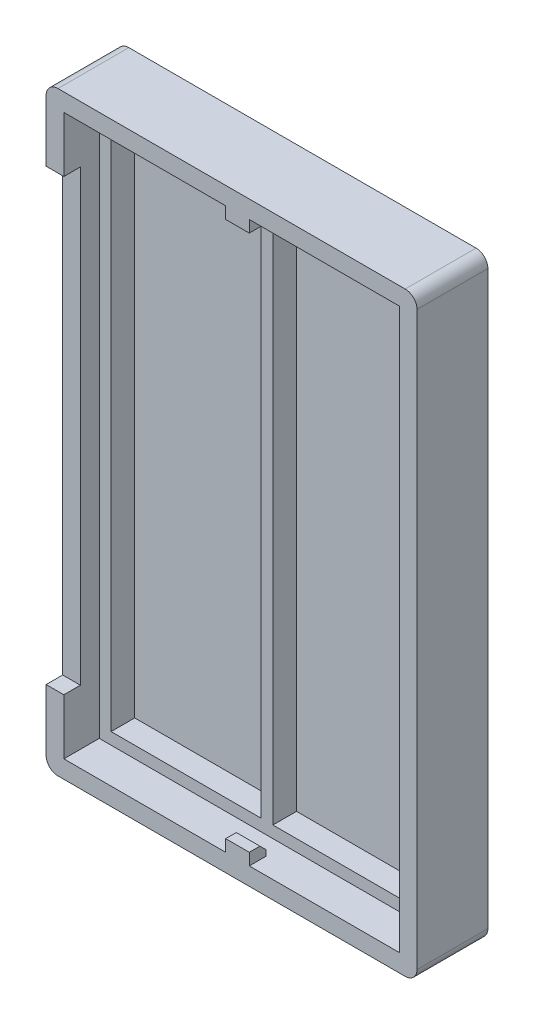
ISO-10303-21;
HEADER;
FILE_DESCRIPTION(('STEP AP214'),'2;1');
FILE_NAME('part.step','',(''),(''),'','','');
FILE_SCHEMA(('AUTOMOTIVE_DESIGN { 1 0 10303 214 1 1 1 1 }'));
ENDSEC;
DATA;
#1=APPLICATION_CONTEXT('core data for automotive mechanical design processes');
#2=APPLICATION_PROTOCOL_DEFINITION('international standard','automotive_design',2000,#1);
#3=PRODUCT_CONTEXT('',#1,'mechanical');
#4=PRODUCT('Part','Part','',(#3));
#5=PRODUCT_RELATED_PRODUCT_CATEGORY('part','',(#4));
#6=PRODUCT_DEFINITION_FORMATION('','',#4);
#7=PRODUCT_DEFINITION_CONTEXT('part definition',#1,'design');
#8=PRODUCT_DEFINITION('design','',#6,#7);
#9=PRODUCT_DEFINITION_SHAPE('','',#8);
#10=(LENGTH_UNIT() NAMED_UNIT(*) SI_UNIT(.MILLI.,.METRE.));
#11=(NAMED_UNIT(*) PLANE_ANGLE_UNIT() SI_UNIT($,.RADIAN.));
#12=(NAMED_UNIT(*) SI_UNIT($,.STERADIAN.) SOLID_ANGLE_UNIT());
#13=UNCERTAINTY_MEASURE_WITH_UNIT(LENGTH_MEASURE(1.E-05),#10,'distance_accuracy_value','');
#14=(GEOMETRIC_REPRESENTATION_CONTEXT(3) GLOBAL_UNCERTAINTY_ASSIGNED_CONTEXT((#13)) GLOBAL_UNIT_ASSIGNED_CONTEXT((#10,
#11,#12)) REPRESENTATION_CONTEXT('',''));
#15=CARTESIAN_POINT('',(0.,0.,0.));
#16=DIRECTION('',(0.,0.,1.));
#17=DIRECTION('',(1.,0.,0.));
#18=AXIS2_PLACEMENT_3D('',#15,#16,#17);
#19=CARTESIAN_POINT('',(-14.2,23.7,6.));
#20=DIRECTION('',(0.,1.,0.));
#21=DIRECTION('',(0.,0.,1.));
#22=AXIS2_PLACEMENT_3D('',#19,#20,#21);
#23=PLANE('',#22);
#24=DIRECTION('',(0.,0.,-1.));
#25=VECTOR('',#24,1.);
#26=CARTESIAN_POINT('',(1.5,23.7,8.23606797749979));
#27=LINE('',#26,#25);
#28=CARTESIAN_POINT('',(1.5,23.7,6.));
#29=VERTEX_POINT('',#28);
#30=CARTESIAN_POINT('',(1.5,23.7,4.6));
#31=VERTEX_POINT('',#30);
#32=EDGE_CURVE('E338',#29,#31,#27,.T.);
#33=ORIENTED_EDGE('',*,*,#32,.T.);
#34=DIRECTION('',(-1.,0.,0.));
#35=VECTOR('',#34,1.);
#36=CARTESIAN_POINT('',(-0.5,23.7,4.6));
#37=LINE('',#36,#35);
#38=CARTESIAN_POINT('',(-0.5,23.7,4.6));
#39=VERTEX_POINT('',#38);
#40=EDGE_CURVE('E331',#31,#39,#37,.T.);
#41=ORIENTED_EDGE('',*,*,#40,.T.);
#42=DIRECTION('',(0.,0.,-1.));
#43=VECTOR('',#42,1.);
#44=CARTESIAN_POINT('',(-0.5,23.7,8.23606797749979));
#45=LINE('',#44,#43);
#46=CARTESIAN_POINT('',(-0.5,23.7,6.));
#47=VERTEX_POINT('',#46);
#48=EDGE_CURVE('E335',#47,#39,#45,.T.);
#49=ORIENTED_EDGE('',*,*,#48,.F.);
#50=DIRECTION('',(1.,0.,0.));
#51=VECTOR('',#50,1.);
#52=CARTESIAN_POINT('',(-14.2,23.7,6.));
#53=LINE('',#52,#51);
#54=CARTESIAN_POINT('',(-14.2,23.7,6.));
#55=VERTEX_POINT('',#54);
#56=EDGE_CURVE('E384',#55,#47,#53,.T.);
#57=ORIENTED_EDGE('',*,*,#56,.F.);
#58=DIRECTION('',(0.,0.,-1.));
#59=VECTOR('',#58,1.);
#60=CARTESIAN_POINT('',(-14.2,23.7,6.));
#61=LINE('',#60,#59);
#62=CARTESIAN_POINT('',(-14.2,23.7,3.));
#63=VERTEX_POINT('',#62);
#64=EDGE_CURVE('E403',#55,#63,#61,.T.);
#65=ORIENTED_EDGE('',*,*,#64,.T.);
#66=DIRECTION('',(-1.,0.,0.));
#67=VECTOR('',#66,1.);
#68=CARTESIAN_POINT('',(14.2,23.7,3.));
#69=LINE('',#68,#67);
#70=CARTESIAN_POINT('',(14.2,23.7,3.));
#71=VERTEX_POINT('',#70);
#72=EDGE_CURVE('E538',#71,#63,#69,.T.);
#73=ORIENTED_EDGE('',*,*,#72,.F.);
#74=DIRECTION('',(0.,0.,-1.));
#75=VECTOR('',#74,1.);
#76=CARTESIAN_POINT('',(14.2,23.7,6.));
#77=LINE('',#76,#75);
#78=CARTESIAN_POINT('',(14.2,23.7,6.));
#79=VERTEX_POINT('',#78);
#80=EDGE_CURVE('E402',#79,#71,#77,.T.);
#81=ORIENTED_EDGE('',*,*,#80,.F.);
#82=EDGE_CURVE('E322',#29,#79,#53,.T.);
#83=ORIENTED_EDGE('',*,*,#82,.F.);
#84=EDGE_LOOP('',(#33,#41,#49,#57,#65,#73,#81,#83));
#85=FACE_BOUND('',#84,.T.);
#86=ADVANCED_FACE('F49',(#85),#23,.F.);
#87=CARTESIAN_POINT('',(14.2,-23.7,6.));
#88=DIRECTION('',(0.,-1.,0.));
#89=DIRECTION('',(0.,0.,-1.));
#90=AXIS2_PLACEMENT_3D('',#87,#88,#89);
#91=PLANE('',#90);
#92=DIRECTION('',(0.,0.,-1.));
#93=VECTOR('',#92,1.);
#94=CARTESIAN_POINT('',(1.5,-23.7,8.23606797749979));
#95=LINE('',#94,#93);
#96=CARTESIAN_POINT('',(1.5,-23.7,6.));
#97=VERTEX_POINT('',#96);
#98=CARTESIAN_POINT('',(1.5,-23.7,4.6));
#99=VERTEX_POINT('',#98);
#100=EDGE_CURVE('E361',#97,#99,#95,.T.);
#101=ORIENTED_EDGE('',*,*,#100,.F.);
#102=DIRECTION('',(-1.,0.,0.));
#103=VECTOR('',#102,1.);
#104=CARTESIAN_POINT('',(14.2,-23.7,6.));
#105=LINE('',#104,#103);
#106=CARTESIAN_POINT('',(14.2,-23.7,6.));
#107=VERTEX_POINT('',#106);
#108=EDGE_CURVE('E393',#107,#97,#105,.T.);
#109=ORIENTED_EDGE('',*,*,#108,.F.);
#110=DIRECTION('',(0.,0.,-1.));
#111=VECTOR('',#110,1.);
#112=CARTESIAN_POINT('',(14.2,-23.7,6.));
#113=LINE('',#112,#111);
#114=CARTESIAN_POINT('',(14.2,-23.7,3.));
#115=VERTEX_POINT('',#114);
#116=EDGE_CURVE('E412',#107,#115,#113,.T.);
#117=ORIENTED_EDGE('',*,*,#116,.T.);
#118=DIRECTION('',(1.,0.,0.));
#119=VECTOR('',#118,1.);
#120=CARTESIAN_POINT('',(-14.2,-23.7,3.));
#121=LINE('',#120,#119);
#122=CARTESIAN_POINT('',(-14.2,-23.7,3.));
#123=VERTEX_POINT('',#122);
#124=EDGE_CURVE('E530',#123,#115,#121,.T.);
#125=ORIENTED_EDGE('',*,*,#124,.F.);
#126=DIRECTION('',(0.,0.,-1.));
#127=VECTOR('',#126,1.);
#128=CARTESIAN_POINT('',(-14.2,-23.7,6.));
#129=LINE('',#128,#127);
#130=CARTESIAN_POINT('',(-14.2,-23.7,6.));
#131=VERTEX_POINT('',#130);
#132=EDGE_CURVE('E408',#131,#123,#129,.T.);
#133=ORIENTED_EDGE('',*,*,#132,.F.);
#134=CARTESIAN_POINT('',(-0.5,-23.7,6.));
#135=VERTEX_POINT('',#134);
#136=EDGE_CURVE('E392',#135,#131,#105,.T.);
#137=ORIENTED_EDGE('',*,*,#136,.F.);
#138=DIRECTION('',(0.,0.,-1.));
#139=VECTOR('',#138,1.);
#140=CARTESIAN_POINT('',(-0.5,-23.7,8.23606797749979));
#141=LINE('',#140,#139);
#142=CARTESIAN_POINT('',(-0.5,-23.7,4.6));
#143=VERTEX_POINT('',#142);
#144=EDGE_CURVE('E357',#135,#143,#141,.T.);
#145=ORIENTED_EDGE('',*,*,#144,.T.);
#146=DIRECTION('',(1.,0.,0.));
#147=VECTOR('',#146,1.);
#148=CARTESIAN_POINT('',(-0.5,-23.7,4.6));
#149=LINE('',#148,#147);
#150=EDGE_CURVE('E372',#143,#99,#149,.T.);
#151=ORIENTED_EDGE('',*,*,#150,.T.);
#152=EDGE_LOOP('',(#101,#109,#117,#125,#133,#137,#145,#151));
#153=FACE_BOUND('',#152,.T.);
#154=ADVANCED_FACE('F657',(#153),#91,.F.);
#155=CARTESIAN_POINT('',(0.,0.,3.));
#156=DIRECTION('',(0.,0.,1.));
#157=DIRECTION('',(1.,0.,0.));
#158=AXIS2_PLACEMENT_3D('',#155,#156,#157);
#159=PLANE('',#158);
#160=ORIENTED_EDGE('',*,*,#124,.T.);
#161=DIRECTION('',(0.,1.,0.));
#162=VECTOR('',#161,1.);
#163=CARTESIAN_POINT('',(14.2,-23.7,3.));
#164=LINE('',#163,#162);
#165=EDGE_CURVE('E534',#115,#71,#164,.T.);
#166=ORIENTED_EDGE('',*,*,#165,.T.);
#167=ORIENTED_EDGE('',*,*,#72,.T.);
#168=DIRECTION('',(0.,-1.,0.));
#169=VECTOR('',#168,1.);
#170=CARTESIAN_POINT('',(-14.2,23.7,3.));
#171=LINE('',#170,#169);
#172=EDGE_CURVE('E542',#63,#123,#171,.T.);
#173=ORIENTED_EDGE('',*,*,#172,.T.);
#174=EDGE_LOOP('',(#160,#166,#167,#173));
#175=FACE_BOUND('',#174,.T.);
#176=DIRECTION('',(0.,-1.,0.));
#177=VECTOR('',#176,1.);
#178=CARTESIAN_POINT('',(0.5,22.7,3.));
#179=LINE('',#178,#177);
#180=CARTESIAN_POINT('',(0.5,22.7,3.));
#181=VERTEX_POINT('',#180);
#182=CARTESIAN_POINT('',(0.500000000000006,-22.7,3.));
#183=VERTEX_POINT('',#182);
#184=EDGE_CURVE('E493',#181,#183,#179,.T.);
#185=ORIENTED_EDGE('',*,*,#184,.F.);
#186=DIRECTION('',(-1.,0.,0.));
#187=VECTOR('',#186,1.);
#188=CARTESIAN_POINT('',(13.2,22.7,3.));
#189=LINE('',#188,#187);
#190=CARTESIAN_POINT('',(13.2,22.7,3.));
#191=VERTEX_POINT('',#190);
#192=EDGE_CURVE('E490',#191,#181,#189,.T.);
#193=ORIENTED_EDGE('',*,*,#192,.F.);
#194=DIRECTION('',(0.,1.,0.));
#195=VECTOR('',#194,1.);
#196=CARTESIAN_POINT('',(13.2,-22.7,3.));
#197=LINE('',#196,#195);
#198=CARTESIAN_POINT('',(13.2,-22.7,3.));
#199=VERTEX_POINT('',#198);
#200=EDGE_CURVE('E501',#199,#191,#197,.T.);
#201=ORIENTED_EDGE('',*,*,#200,.F.);
#202=DIRECTION('',(1.,0.,0.));
#203=VECTOR('',#202,1.);
#204=CARTESIAN_POINT('',(0.500000000000006,-22.7,3.));
#205=LINE('',#204,#203);
#206=EDGE_CURVE('E497',#183,#199,#205,.T.);
#207=ORIENTED_EDGE('',*,*,#206,.F.);
#208=EDGE_LOOP('',(#185,#193,#201,#207));
#209=FACE_BOUND('',#208,.T.);
#210=DIRECTION('',(0.,-1.,0.));
#211=VECTOR('',#210,1.);
#212=CARTESIAN_POINT('',(-13.2,22.7,3.));
#213=LINE('',#212,#211);
#214=CARTESIAN_POINT('',(-13.2,22.7,3.));
#215=VERTEX_POINT('',#214);
#216=CARTESIAN_POINT('',(-13.2,-22.7,3.));
#217=VERTEX_POINT('',#216);
#218=EDGE_CURVE('E452',#215,#217,#213,.T.);
#219=ORIENTED_EDGE('',*,*,#218,.F.);
#220=DIRECTION('',(-1.,0.,0.));
#221=VECTOR('',#220,1.);
#222=CARTESIAN_POINT('',(-0.5,22.7,3.));
#223=LINE('',#222,#221);
#224=CARTESIAN_POINT('',(-0.5,22.7,3.));
#225=VERTEX_POINT('',#224);
#226=EDGE_CURVE('E449',#225,#215,#223,.T.);
#227=ORIENTED_EDGE('',*,*,#226,.F.);
#228=DIRECTION('',(0.,1.,0.));
#229=VECTOR('',#228,1.);
#230=CARTESIAN_POINT('',(-0.5,22.7,3.));
#231=LINE('',#230,#229);
#232=CARTESIAN_POINT('',(-0.499999999999995,-22.7,3.));
#233=VERTEX_POINT('',#232);
#234=EDGE_CURVE('E460',#233,#225,#231,.T.);
#235=ORIENTED_EDGE('',*,*,#234,.F.);
#236=DIRECTION('',(1.,0.,0.));
#237=VECTOR('',#236,1.);
#238=CARTESIAN_POINT('',(-13.2,-22.7,3.));
#239=LINE('',#238,#237);
#240=EDGE_CURVE('E456',#217,#233,#239,.T.);
#241=ORIENTED_EDGE('',*,*,#240,.F.);
#242=EDGE_LOOP('',(#219,#227,#235,#241));
#243=FACE_BOUND('',#242,.T.);
#244=ADVANCED_FACE('F662',(#175,#209,#243),#159,.T.);
#245=CARTESIAN_POINT('',(13.2,22.7,3.));
#246=DIRECTION('',(0.,-1.,0.));
#247=DIRECTION('',(0.,0.,-1.));
#248=AXIS2_PLACEMENT_3D('',#245,#246,#247);
#249=PLANE('',#248);
#250=DIRECTION('',(-1.,0.,0.));
#251=VECTOR('',#250,1.);
#252=CARTESIAN_POINT('',(13.2,22.7,1.));
#253=LINE('',#252,#251);
#254=CARTESIAN_POINT('',(13.2,22.7,1.));
#255=VERTEX_POINT('',#254);
#256=CARTESIAN_POINT('',(0.5,22.7,1.));
#257=VERTEX_POINT('',#256);
#258=EDGE_CURVE('E489',#255,#257,#253,.T.);
#259=ORIENTED_EDGE('',*,*,#258,.F.);
#260=DIRECTION('',(0.,0.,-1.));
#261=VECTOR('',#260,1.);
#262=CARTESIAN_POINT('',(13.2,22.7,3.));
#263=LINE('',#262,#261);
#264=EDGE_CURVE('E504',#191,#255,#263,.T.);
#265=ORIENTED_EDGE('',*,*,#264,.F.);
#266=ORIENTED_EDGE('',*,*,#192,.T.);
#267=DIRECTION('',(0.,0.,-1.));
#268=VECTOR('',#267,1.);
#269=CARTESIAN_POINT('',(0.5,22.7,3.));
#270=LINE('',#269,#268);
#271=EDGE_CURVE('E526',#181,#257,#270,.T.);
#272=ORIENTED_EDGE('',*,*,#271,.T.);
#273=EDGE_LOOP('',(#259,#265,#266,#272));
#274=FACE_BOUND('',#273,.T.);
#275=ADVANCED_FACE('F708',(#274),#249,.T.);
#276=CARTESIAN_POINT('',(0.5,22.7,3.));
#277=DIRECTION('',(1.,0.,0.));
#278=DIRECTION('',(0.,1.,0.));
#279=AXIS2_PLACEMENT_3D('',#276,#277,#278);
#280=PLANE('',#279);
#281=DIRECTION('',(0.,-1.,0.));
#282=VECTOR('',#281,1.);
#283=CARTESIAN_POINT('',(0.5,22.7,1.));
#284=LINE('',#283,#282);
#285=CARTESIAN_POINT('',(0.500000000000006,-22.7,1.));
#286=VERTEX_POINT('',#285);
#287=EDGE_CURVE('E507',#257,#286,#284,.T.);
#288=ORIENTED_EDGE('',*,*,#287,.F.);
#289=ORIENTED_EDGE('',*,*,#271,.F.);
#290=ORIENTED_EDGE('',*,*,#184,.T.);
#291=DIRECTION('',(0.,0.,-1.));
#292=VECTOR('',#291,1.);
#293=CARTESIAN_POINT('',(0.500000000000006,-22.7,3.));
#294=LINE('',#293,#292);
#295=EDGE_CURVE('E522',#183,#286,#294,.T.);
#296=ORIENTED_EDGE('',*,*,#295,.T.);
#297=EDGE_LOOP('',(#288,#289,#290,#296));
#298=FACE_BOUND('',#297,.T.);
#299=ADVANCED_FACE('F704',(#298),#280,.T.);
#300=CARTESIAN_POINT('',(0.500000000000006,-22.7,3.));
#301=DIRECTION('',(0.,1.,0.));
#302=DIRECTION('',(0.,0.,1.));
#303=AXIS2_PLACEMENT_3D('',#300,#301,#302);
#304=PLANE('',#303);
#305=DIRECTION('',(1.,0.,0.));
#306=VECTOR('',#305,1.);
#307=CARTESIAN_POINT('',(0.500000000000006,-22.7,1.));
#308=LINE('',#307,#306);
#309=CARTESIAN_POINT('',(13.2,-22.7,1.));
#310=VERTEX_POINT('',#309);
#311=EDGE_CURVE('E510',#286,#310,#308,.T.);
#312=ORIENTED_EDGE('',*,*,#311,.F.);
#313=ORIENTED_EDGE('',*,*,#295,.F.);
#314=ORIENTED_EDGE('',*,*,#206,.T.);
#315=DIRECTION('',(0.,0.,-1.));
#316=VECTOR('',#315,1.);
#317=CARTESIAN_POINT('',(13.2,-22.7,3.));
#318=LINE('',#317,#316);
#319=EDGE_CURVE('E518',#199,#310,#318,.T.);
#320=ORIENTED_EDGE('',*,*,#319,.T.);
#321=EDGE_LOOP('',(#312,#313,#314,#320));
#322=FACE_BOUND('',#321,.T.);
#323=ADVANCED_FACE('F700',(#322),#304,.T.);
#324=CARTESIAN_POINT('',(13.2,-22.7,3.));
#325=DIRECTION('',(-1.,0.,0.));
#326=DIRECTION('',(0.,0.,1.));
#327=AXIS2_PLACEMENT_3D('',#324,#325,#326);
#328=PLANE('',#327);
#329=DIRECTION('',(0.,1.,0.));
#330=VECTOR('',#329,1.);
#331=CARTESIAN_POINT('',(13.2,-22.7,1.));
#332=LINE('',#331,#330);
#333=EDGE_CURVE('E494',#310,#255,#332,.T.);
#334=ORIENTED_EDGE('',*,*,#333,.F.);
#335=ORIENTED_EDGE('',*,*,#319,.F.);
#336=ORIENTED_EDGE('',*,*,#200,.T.);
#337=ORIENTED_EDGE('',*,*,#264,.T.);
#338=EDGE_LOOP('',(#334,#335,#336,#337));
#339=FACE_BOUND('',#338,.T.);
#340=ADVANCED_FACE('F696',(#339),#328,.T.);
#341=CARTESIAN_POINT('',(-0.5,22.7,3.));
#342=DIRECTION('',(0.,-1.,0.));
#343=DIRECTION('',(0.,0.,-1.));
#344=AXIS2_PLACEMENT_3D('',#341,#342,#343);
#345=PLANE('',#344);
#346=DIRECTION('',(-1.,0.,0.));
#347=VECTOR('',#346,1.);
#348=CARTESIAN_POINT('',(-0.5,22.7,1.));
#349=LINE('',#348,#347);
#350=CARTESIAN_POINT('',(-0.5,22.7,1.));
#351=VERTEX_POINT('',#350);
#352=CARTESIAN_POINT('',(-13.2,22.7,1.));
#353=VERTEX_POINT('',#352);
#354=EDGE_CURVE('E434',#351,#353,#349,.T.);
#355=ORIENTED_EDGE('',*,*,#354,.F.);
#356=DIRECTION('',(0.,0.,-1.));
#357=VECTOR('',#356,1.);
#358=CARTESIAN_POINT('',(-0.5,22.7,3.));
#359=LINE('',#358,#357);
#360=EDGE_CURVE('E463',#225,#351,#359,.T.);
#361=ORIENTED_EDGE('',*,*,#360,.F.);
#362=ORIENTED_EDGE('',*,*,#226,.T.);
#363=DIRECTION('',(0.,0.,-1.));
#364=VECTOR('',#363,1.);
#365=CARTESIAN_POINT('',(-13.2,22.7,3.));
#366=LINE('',#365,#364);
#367=EDGE_CURVE('E485',#215,#353,#366,.T.);
#368=ORIENTED_EDGE('',*,*,#367,.T.);
#369=EDGE_LOOP('',(#355,#361,#362,#368));
#370=FACE_BOUND('',#369,.T.);
#371=ADVANCED_FACE('F692',(#370),#345,.T.);
#372=CARTESIAN_POINT('',(-13.2,22.7,3.));
#373=DIRECTION('',(1.,0.,0.));
#374=DIRECTION('',(0.,0.,-1.));
#375=AXIS2_PLACEMENT_3D('',#372,#373,#374);
#376=PLANE('',#375);
#377=DIRECTION('',(0.,-1.,0.));
#378=VECTOR('',#377,1.);
#379=CARTESIAN_POINT('',(-13.2,22.7,1.));
#380=LINE('',#379,#378);
#381=CARTESIAN_POINT('',(-13.2,-22.7,1.));
#382=VERTEX_POINT('',#381);
#383=EDGE_CURVE('E466',#353,#382,#380,.T.);
#384=ORIENTED_EDGE('',*,*,#383,.F.);
#385=ORIENTED_EDGE('',*,*,#367,.F.);
#386=ORIENTED_EDGE('',*,*,#218,.T.);
#387=DIRECTION('',(0.,0.,-1.));
#388=VECTOR('',#387,1.);
#389=CARTESIAN_POINT('',(-13.2,-22.7,3.));
#390=LINE('',#389,#388);
#391=EDGE_CURVE('E481',#217,#382,#390,.T.);
#392=ORIENTED_EDGE('',*,*,#391,.T.);
#393=EDGE_LOOP('',(#384,#385,#386,#392));
#394=FACE_BOUND('',#393,.T.);
#395=ADVANCED_FACE('F688',(#394),#376,.T.);
#396=CARTESIAN_POINT('',(-13.2,-22.7,3.));
#397=DIRECTION('',(0.,1.,0.));
#398=DIRECTION('',(0.,0.,1.));
#399=AXIS2_PLACEMENT_3D('',#396,#397,#398);
#400=PLANE('',#399);
#401=DIRECTION('',(1.,0.,0.));
#402=VECTOR('',#401,1.);
#403=CARTESIAN_POINT('',(-13.2,-22.7,1.));
#404=LINE('',#403,#402);
#405=CARTESIAN_POINT('',(-0.499999999999995,-22.7,1.));
#406=VERTEX_POINT('',#405);
#407=EDGE_CURVE('E469',#382,#406,#404,.T.);
#408=ORIENTED_EDGE('',*,*,#407,.F.);
#409=ORIENTED_EDGE('',*,*,#391,.F.);
#410=ORIENTED_EDGE('',*,*,#240,.T.);
#411=DIRECTION('',(0.,0.,-1.));
#412=VECTOR('',#411,1.);
#413=CARTESIAN_POINT('',(-0.499999999999995,-22.7,3.));
#414=LINE('',#413,#412);
#415=EDGE_CURVE('E477',#233,#406,#414,.T.);
#416=ORIENTED_EDGE('',*,*,#415,.T.);
#417=EDGE_LOOP('',(#408,#409,#410,#416));
#418=FACE_BOUND('',#417,.T.);
#419=ADVANCED_FACE('F684',(#418),#400,.T.);
#420=CARTESIAN_POINT('',(-0.5,22.7,3.));
#421=DIRECTION('',(-1.,0.,0.));
#422=DIRECTION('',(0.,-1.,0.));
#423=AXIS2_PLACEMENT_3D('',#420,#421,#422);
#424=PLANE('',#423);
#425=DIRECTION('',(0.,1.,0.));
#426=VECTOR('',#425,1.);
#427=CARTESIAN_POINT('',(-0.5,22.7,1.));
#428=LINE('',#427,#426);
#429=EDGE_CURVE('E453',#406,#351,#428,.T.);
#430=ORIENTED_EDGE('',*,*,#429,.F.);
#431=ORIENTED_EDGE('',*,*,#415,.F.);
#432=ORIENTED_EDGE('',*,*,#234,.T.);
#433=ORIENTED_EDGE('',*,*,#360,.T.);
#434=EDGE_LOOP('',(#430,#431,#432,#433));
#435=FACE_BOUND('',#434,.T.);
#436=ADVANCED_FACE('F680',(#435),#424,.T.);
#437=CARTESIAN_POINT('',(0.,0.,1.));
#438=DIRECTION('',(0.,0.,1.));
#439=DIRECTION('',(1.,0.,0.));
#440=AXIS2_PLACEMENT_3D('',#437,#438,#439);
#441=PLANE('',#440);
#442=ORIENTED_EDGE('',*,*,#354,.T.);
#443=ORIENTED_EDGE('',*,*,#383,.T.);
#444=ORIENTED_EDGE('',*,*,#407,.T.);
#445=ORIENTED_EDGE('',*,*,#429,.T.);
#446=EDGE_LOOP('',(#442,#443,#444,#445));
#447=FACE_BOUND('',#446,.T.);
#448=ADVANCED_FACE('F683',(#447),#441,.T.);
#449=ORIENTED_EDGE('',*,*,#258,.T.);
#450=ORIENTED_EDGE('',*,*,#287,.T.);
#451=ORIENTED_EDGE('',*,*,#311,.T.);
#452=ORIENTED_EDGE('',*,*,#333,.T.);
#453=EDGE_LOOP('',(#449,#450,#451,#452));
#454=FACE_BOUND('',#453,.T.);
#455=ADVANCED_FACE('F679',(#454),#441,.T.);
#456=CARTESIAN_POINT('',(15.7,-25.2,6.));
#457=DIRECTION('',(0.,-1.,0.));
#458=DIRECTION('',(1.,0.,0.));
#459=AXIS2_PLACEMENT_3D('',#456,#457,#458);
#460=PLANE('',#459);
#461=DIRECTION('',(-1.,0.,0.));
#462=VECTOR('',#461,1.);
#463=CARTESIAN_POINT('',(15.7,-25.2,6.));
#464=LINE('',#463,#462);
#465=CARTESIAN_POINT('',(14.7,-25.2,6.));
#466=VERTEX_POINT('',#465);
#467=CARTESIAN_POINT('',(-14.7,-25.2,6.));
#468=VERTEX_POINT('',#467);
#469=EDGE_CURVE('E418',#466,#468,#464,.T.);
#470=ORIENTED_EDGE('',*,*,#469,.T.);
#471=DIRECTION('',(0.,0.,-1.));
#472=VECTOR('',#471,1.);
#473=CARTESIAN_POINT('',(-14.7,-25.2,6.));
#474=LINE('',#473,#472);
#475=CARTESIAN_POINT('',(-14.7,-25.2,0.));
#476=VERTEX_POINT('',#475);
#477=EDGE_CURVE('E583',#468,#476,#474,.T.);
#478=ORIENTED_EDGE('',*,*,#477,.T.);
#479=DIRECTION('',(-1.,0.,0.));
#480=VECTOR('',#479,1.);
#481=CARTESIAN_POINT('',(15.7,-25.2,0.));
#482=LINE('',#481,#480);
#483=CARTESIAN_POINT('',(14.7,-25.2,0.));
#484=VERTEX_POINT('',#483);
#485=EDGE_CURVE('E407',#484,#476,#482,.T.);
#486=ORIENTED_EDGE('',*,*,#485,.F.);
#487=DIRECTION('',(0.,0.,-1.));
#488=VECTOR('',#487,1.);
#489=CARTESIAN_POINT('',(14.7,-25.2,6.));
#490=LINE('',#489,#488);
#491=EDGE_CURVE('E581',#484,#466,#490,.F.);
#492=ORIENTED_EDGE('',*,*,#491,.T.);
#493=EDGE_LOOP('',(#470,#478,#486,#492));
#494=FACE_BOUND('',#493,.T.);
#495=ADVANCED_FACE('F650',(#494),#460,.T.);
#496=CARTESIAN_POINT('',(15.7,25.2,6.));
#497=DIRECTION('',(1.,0.,0.));
#498=DIRECTION('',(0.,0.,-1.));
#499=AXIS2_PLACEMENT_3D('',#496,#497,#498);
#500=PLANE('',#499);
#501=DIRECTION('',(0.,-1.,0.));
#502=VECTOR('',#501,1.);
#503=CARTESIAN_POINT('',(15.7,25.2,0.));
#504=LINE('',#503,#502);
#505=CARTESIAN_POINT('',(15.7,24.2,0.));
#506=VERTEX_POINT('',#505);
#507=CARTESIAN_POINT('',(15.7,-24.2,0.));
#508=VERTEX_POINT('',#507);
#509=EDGE_CURVE('E423',#506,#508,#504,.T.);
#510=ORIENTED_EDGE('',*,*,#509,.F.);
#511=DIRECTION('',(0.,0.,-1.));
#512=VECTOR('',#511,1.);
#513=CARTESIAN_POINT('',(15.7,24.2,6.));
#514=LINE('',#513,#512);
#515=CARTESIAN_POINT('',(15.7,24.2,6.));
#516=VERTEX_POINT('',#515);
#517=EDGE_CURVE('E11',#506,#516,#514,.F.);
#518=ORIENTED_EDGE('',*,*,#517,.T.);
#519=DIRECTION('',(0.,-1.,0.));
#520=VECTOR('',#519,1.);
#521=CARTESIAN_POINT('',(15.7,25.2,6.));
#522=LINE('',#521,#520);
#523=CARTESIAN_POINT('',(15.7,-24.2,6.));
#524=VERTEX_POINT('',#523);
#525=EDGE_CURVE('E430',#516,#524,#522,.T.);
#526=ORIENTED_EDGE('',*,*,#525,.T.);
#527=DIRECTION('',(0.,0.,-1.));
#528=VECTOR('',#527,1.);
#529=CARTESIAN_POINT('',(15.7,-24.2,6.));
#530=LINE('',#529,#528);
#531=EDGE_CURVE('E58',#524,#508,#530,.T.);
#532=ORIENTED_EDGE('',*,*,#531,.T.);
#533=EDGE_LOOP('',(#510,#518,#526,#532));
#534=FACE_BOUND('',#533,.T.);
#535=ADVANCED_FACE('F627',(#534),#500,.T.);
#536=CARTESIAN_POINT('',(-15.7,25.2,6.));
#537=DIRECTION('',(0.,1.,0.));
#538=DIRECTION('',(-1.,0.,0.));
#539=AXIS2_PLACEMENT_3D('',#536,#537,#538);
#540=PLANE('',#539);
#541=DIRECTION('',(1.,0.,0.));
#542=VECTOR('',#541,1.);
#543=CARTESIAN_POINT('',(-15.7,25.2,0.));
#544=LINE('',#543,#542);
#545=CARTESIAN_POINT('',(-14.7,25.2,0.));
#546=VERTEX_POINT('',#545);
#547=CARTESIAN_POINT('',(14.7,25.2,0.));
#548=VERTEX_POINT('',#547);
#549=EDGE_CURVE('E442',#546,#548,#544,.T.);
#550=ORIENTED_EDGE('',*,*,#549,.F.);
#551=DIRECTION('',(0.,0.,-1.));
#552=VECTOR('',#551,1.);
#553=CARTESIAN_POINT('',(-14.7,25.2,6.));
#554=LINE('',#553,#552);
#555=CARTESIAN_POINT('',(-14.7,25.2,6.));
#556=VERTEX_POINT('',#555);
#557=EDGE_CURVE('E72',#546,#556,#554,.F.);
#558=ORIENTED_EDGE('',*,*,#557,.T.);
#559=DIRECTION('',(1.,0.,0.));
#560=VECTOR('',#559,1.);
#561=CARTESIAN_POINT('',(-15.7,25.2,6.));
#562=LINE('',#561,#560);
#563=CARTESIAN_POINT('',(14.7,25.2,6.));
#564=VERTEX_POINT('',#563);
#565=EDGE_CURVE('E427',#556,#564,#562,.T.);
#566=ORIENTED_EDGE('',*,*,#565,.T.);
#567=DIRECTION('',(0.,0.,-1.));
#568=VECTOR('',#567,1.);
#569=CARTESIAN_POINT('',(14.7,25.2,6.));
#570=LINE('',#569,#568);
#571=EDGE_CURVE('E617',#564,#548,#570,.T.);
#572=ORIENTED_EDGE('',*,*,#571,.T.);
#573=EDGE_LOOP('',(#550,#558,#566,#572));
#574=FACE_BOUND('',#573,.T.);
#575=ADVANCED_FACE('F637',(#574),#540,.T.);
#576=CARTESIAN_POINT('',(-15.7,-25.2,6.));
#577=DIRECTION('',(-1.,0.,0.));
#578=DIRECTION('',(0.,-1.,0.));
#579=AXIS2_PLACEMENT_3D('',#576,#577,#578);
#580=PLANE('',#579);
#581=DIRECTION('',(0.,1.,0.));
#582=VECTOR('',#581,1.);
#583=CARTESIAN_POINT('',(-15.7,-25.2,0.));
#584=LINE('',#583,#582);
#585=CARTESIAN_POINT('',(-15.7,-24.2,0.));
#586=VERTEX_POINT('',#585);
#587=CARTESIAN_POINT('',(-15.7,24.2,0.));
#588=VERTEX_POINT('',#587);
#589=EDGE_CURVE('E438',#586,#588,#584,.T.);
#590=ORIENTED_EDGE('',*,*,#589,.F.);
#591=DIRECTION('',(0.,0.,-1.));
#592=VECTOR('',#591,1.);
#593=CARTESIAN_POINT('',(-15.7,-24.2,6.));
#594=LINE('',#593,#592);
#595=CARTESIAN_POINT('',(-15.7,-24.2,6.));
#596=VERTEX_POINT('',#595);
#597=EDGE_CURVE('E603',#586,#596,#594,.F.);
#598=ORIENTED_EDGE('',*,*,#597,.T.);
#599=DIRECTION('',(0.,1.,0.));
#600=VECTOR('',#599,1.);
#601=CARTESIAN_POINT('',(-15.7,-25.2,6.));
#602=LINE('',#601,#600);
#603=CARTESIAN_POINT('',(-15.7,-19.,6.));
#604=VERTEX_POINT('',#603);
#605=EDGE_CURVE('E424',#596,#604,#602,.T.);
#606=ORIENTED_EDGE('',*,*,#605,.T.);
#607=DIRECTION('',(0.,0.,1.));
#608=VECTOR('',#607,1.);
#609=CARTESIAN_POINT('',(-15.7,-19.,6.));
#610=LINE('',#609,#608);
#611=CARTESIAN_POINT('',(-15.7,-19.,4.6));
#612=VERTEX_POINT('',#611);
#613=EDGE_CURVE('E285',#612,#604,#610,.T.);
#614=ORIENTED_EDGE('',*,*,#613,.F.);
#615=DIRECTION('',(0.,1.,0.));
#616=VECTOR('',#615,1.);
#617=CARTESIAN_POINT('',(-15.7,-25.2,4.6));
#618=LINE('',#617,#616);
#619=CARTESIAN_POINT('',(-15.7,19.,4.6));
#620=VERTEX_POINT('',#619);
#621=EDGE_CURVE('E289',#612,#620,#618,.T.);
#622=ORIENTED_EDGE('',*,*,#621,.T.);
#623=DIRECTION('',(0.,0.,-1.));
#624=VECTOR('',#623,1.);
#625=CARTESIAN_POINT('',(-15.7,19.,6.));
#626=LINE('',#625,#624);
#627=CARTESIAN_POINT('',(-15.7,19.,6.));
#628=VERTEX_POINT('',#627);
#629=EDGE_CURVE('E272',#628,#620,#626,.T.);
#630=ORIENTED_EDGE('',*,*,#629,.F.);
#631=CARTESIAN_POINT('',(-15.7,24.2,6.));
#632=VERTEX_POINT('',#631);
#633=EDGE_CURVE('E422',#628,#632,#602,.T.);
#634=ORIENTED_EDGE('',*,*,#633,.T.);
#635=DIRECTION('',(0.,0.,-1.));
#636=VECTOR('',#635,1.);
#637=CARTESIAN_POINT('',(-15.7,24.2,6.));
#638=LINE('',#637,#636);
#639=EDGE_CURVE('E599',#632,#588,#638,.T.);
#640=ORIENTED_EDGE('',*,*,#639,.T.);
#641=EDGE_LOOP('',(#590,#598,#606,#614,#622,#630,#634,#640));
#642=FACE_BOUND('',#641,.T.);
#643=ADVANCED_FACE('F298',(#642),#580,.T.);
#644=CARTESIAN_POINT('',(0.,0.,6.));
#645=DIRECTION('',(0.,0.,-1.));
#646=DIRECTION('',(-1.,0.,0.));
#647=AXIS2_PLACEMENT_3D('',#644,#645,#646);
#648=PLANE('',#647);
#649=ORIENTED_EDGE('',*,*,#605,.F.);
#650=CARTESIAN_POINT('',(-14.7,-24.2,6.));
#651=DIRECTION('',(0.,0.,-1.));
#652=DIRECTION('',(-1.,0.,0.));
#653=AXIS2_PLACEMENT_3D('',#650,#651,#652);
#654=CIRCLE('',#653,1.);
#655=EDGE_CURVE('E614',#596,#468,#654,.F.);
#656=ORIENTED_EDGE('',*,*,#655,.T.);
#657=ORIENTED_EDGE('',*,*,#469,.F.);
#658=CARTESIAN_POINT('',(14.7,-24.2,6.));
#659=DIRECTION('',(0.,0.,-1.));
#660=DIRECTION('',(-1.,0.,0.));
#661=AXIS2_PLACEMENT_3D('',#658,#659,#660);
#662=CIRCLE('',#661,1.);
#663=EDGE_CURVE('E606',#466,#524,#662,.F.);
#664=ORIENTED_EDGE('',*,*,#663,.T.);
#665=ORIENTED_EDGE('',*,*,#525,.F.);
#666=CARTESIAN_POINT('',(14.7,24.2,6.));
#667=DIRECTION('',(0.,0.,-1.));
#668=DIRECTION('',(-1.,0.,0.));
#669=AXIS2_PLACEMENT_3D('',#666,#667,#668);
#670=CIRCLE('',#669,1.);
#671=EDGE_CURVE('E65',#516,#564,#670,.F.);
#672=ORIENTED_EDGE('',*,*,#671,.T.);
#673=ORIENTED_EDGE('',*,*,#565,.F.);
#674=CARTESIAN_POINT('',(-14.7,24.2,6.));
#675=DIRECTION('',(0.,0.,-1.));
#676=DIRECTION('',(-1.,0.,0.));
#677=AXIS2_PLACEMENT_3D('',#674,#675,#676);
#678=CIRCLE('',#677,1.);
#679=EDGE_CURVE('E611',#556,#632,#678,.F.);
#680=ORIENTED_EDGE('',*,*,#679,.T.);
#681=ORIENTED_EDGE('',*,*,#633,.F.);
#682=DIRECTION('',(-1.,0.,0.));
#683=VECTOR('',#682,1.);
#684=CARTESIAN_POINT('',(-9.39543051071511,19.,6.));
#685=LINE('',#684,#683);
#686=CARTESIAN_POINT('',(-14.2,19.,6.));
#687=VERTEX_POINT('',#686);
#688=EDGE_CURVE('E278',#687,#628,#685,.T.);
#689=ORIENTED_EDGE('',*,*,#688,.F.);
#690=DIRECTION('',(0.,1.,0.));
#691=VECTOR('',#690,1.);
#692=CARTESIAN_POINT('',(-14.2,-23.7,6.));
#693=LINE('',#692,#691);
#694=EDGE_CURVE('E397',#687,#55,#693,.T.);
#695=ORIENTED_EDGE('',*,*,#694,.T.);
#696=ORIENTED_EDGE('',*,*,#56,.T.);
#697=DIRECTION('',(0.,1.,0.));
#698=VECTOR('',#697,1.);
#699=CARTESIAN_POINT('',(-0.5,22.7,6.));
#700=LINE('',#699,#698);
#701=CARTESIAN_POINT('',(-0.5,22.7,6.));
#702=VERTEX_POINT('',#701);
#703=EDGE_CURVE('E319',#702,#47,#700,.T.);
#704=ORIENTED_EDGE('',*,*,#703,.F.);
#705=DIRECTION('',(-1.,0.,0.));
#706=VECTOR('',#705,1.);
#707=CARTESIAN_POINT('',(-0.5,22.7,6.));
#708=LINE('',#707,#706);
#709=CARTESIAN_POINT('',(1.5,22.7,6.));
#710=VERTEX_POINT('',#709);
#711=EDGE_CURVE('E314',#710,#702,#708,.T.);
#712=ORIENTED_EDGE('',*,*,#711,.F.);
#713=DIRECTION('',(0.,-1.,0.));
#714=VECTOR('',#713,1.);
#715=CARTESIAN_POINT('',(1.5,22.7,6.));
#716=LINE('',#715,#714);
#717=EDGE_CURVE('E310',#29,#710,#716,.T.);
#718=ORIENTED_EDGE('',*,*,#717,.F.);
#719=ORIENTED_EDGE('',*,*,#82,.T.);
#720=DIRECTION('',(0.,-1.,0.));
#721=VECTOR('',#720,1.);
#722=CARTESIAN_POINT('',(14.2,23.7,6.));
#723=LINE('',#722,#721);
#724=EDGE_CURVE('E388',#79,#107,#723,.T.);
#725=ORIENTED_EDGE('',*,*,#724,.T.);
#726=ORIENTED_EDGE('',*,*,#108,.T.);
#727=DIRECTION('',(0.,-1.,0.));
#728=VECTOR('',#727,1.);
#729=CARTESIAN_POINT('',(1.5,-22.7,6.));
#730=LINE('',#729,#728);
#731=CARTESIAN_POINT('',(1.5,-22.7,6.));
#732=VERTEX_POINT('',#731);
#733=EDGE_CURVE('E349',#732,#97,#730,.T.);
#734=ORIENTED_EDGE('',*,*,#733,.F.);
#735=DIRECTION('',(1.,0.,0.));
#736=VECTOR('',#735,1.);
#737=CARTESIAN_POINT('',(-0.5,-22.7,6.));
#738=LINE('',#737,#736);
#739=CARTESIAN_POINT('',(-0.5,-22.7,6.));
#740=VERTEX_POINT('',#739);
#741=EDGE_CURVE('E284',#740,#732,#738,.T.);
#742=ORIENTED_EDGE('',*,*,#741,.F.);
#743=DIRECTION('',(0.,1.,0.));
#744=VECTOR('',#743,1.);
#745=CARTESIAN_POINT('',(-0.5,-22.7,6.));
#746=LINE('',#745,#744);
#747=EDGE_CURVE('E353',#135,#740,#746,.T.);
#748=ORIENTED_EDGE('',*,*,#747,.F.);
#749=ORIENTED_EDGE('',*,*,#136,.T.);
#750=CARTESIAN_POINT('',(-14.2,-19.,6.));
#751=VERTEX_POINT('',#750);
#752=EDGE_CURVE('E398',#131,#751,#693,.T.);
#753=ORIENTED_EDGE('',*,*,#752,.T.);
#754=DIRECTION('',(1.,0.,0.));
#755=VECTOR('',#754,1.);
#756=CARTESIAN_POINT('',(-9.39543051071511,-19.,6.));
#757=LINE('',#756,#755);
#758=EDGE_CURVE('E1099',#604,#751,#757,.T.);
#759=ORIENTED_EDGE('',*,*,#758,.F.);
#760=EDGE_LOOP('',(#649,#656,#657,#664,#665,#672,#673,#680,#681,#689,#695,#696,#704,#712,#718,
#719,#725,#726,#734,#742,#748,#749,#753,#759));
#761=FACE_BOUND('',#760,.T.);
#762=ADVANCED_FACE('F640',(#761),#648,.F.);
#763=CARTESIAN_POINT('',(-14.2,-23.7,6.));
#764=DIRECTION('',(-1.,0.,0.));
#765=DIRECTION('',(0.,0.,1.));
#766=AXIS2_PLACEMENT_3D('',#763,#764,#765);
#767=PLANE('',#766);
#768=ORIENTED_EDGE('',*,*,#694,.F.);
#769=DIRECTION('',(0.,0.,-1.));
#770=VECTOR('',#769,1.);
#771=CARTESIAN_POINT('',(-14.2,19.,6.));
#772=LINE('',#771,#770);
#773=CARTESIAN_POINT('',(-14.2,19.,4.6));
#774=VERTEX_POINT('',#773);
#775=EDGE_CURVE('E578',#687,#774,#772,.T.);
#776=ORIENTED_EDGE('',*,*,#775,.T.);
#777=DIRECTION('',(0.,1.,0.));
#778=VECTOR('',#777,1.);
#779=CARTESIAN_POINT('',(-14.2,-23.7,4.6));
#780=LINE('',#779,#778);
#781=CARTESIAN_POINT('',(-14.2,-19.,4.6));
#782=VERTEX_POINT('',#781);
#783=EDGE_CURVE('E292',#782,#774,#780,.T.);
#784=ORIENTED_EDGE('',*,*,#783,.F.);
#785=DIRECTION('',(0.,0.,1.));
#786=VECTOR('',#785,1.);
#787=CARTESIAN_POINT('',(-14.2,-19.,6.));
#788=LINE('',#787,#786);
#789=EDGE_CURVE('E574',#782,#751,#788,.T.);
#790=ORIENTED_EDGE('',*,*,#789,.T.);
#791=ORIENTED_EDGE('',*,*,#752,.F.);
#792=ORIENTED_EDGE('',*,*,#132,.T.);
#793=ORIENTED_EDGE('',*,*,#172,.F.);
#794=ORIENTED_EDGE('',*,*,#64,.F.);
#795=EDGE_LOOP('',(#768,#776,#784,#790,#791,#792,#793,#794));
#796=FACE_BOUND('',#795,.T.);
#797=ADVANCED_FACE('F670',(#796),#767,.F.);
#798=CARTESIAN_POINT('',(14.2,23.7,6.));
#799=DIRECTION('',(1.,0.,0.));
#800=DIRECTION('',(0.,0.,-1.));
#801=AXIS2_PLACEMENT_3D('',#798,#799,#800);
#802=PLANE('',#801);
#803=ORIENTED_EDGE('',*,*,#165,.F.);
#804=ORIENTED_EDGE('',*,*,#116,.F.);
#805=ORIENTED_EDGE('',*,*,#724,.F.);
#806=ORIENTED_EDGE('',*,*,#80,.T.);
#807=EDGE_LOOP('',(#803,#804,#805,#806));
#808=FACE_BOUND('',#807,.T.);
#809=ADVANCED_FACE('F667',(#808),#802,.F.);
#810=CARTESIAN_POINT('',(0.,0.,0.));
#811=DIRECTION('',(0.,0.,1.));
#812=DIRECTION('',(1.,0.,0.));
#813=AXIS2_PLACEMENT_3D('',#810,#811,#812);
#814=PLANE('',#813);
#815=ORIENTED_EDGE('',*,*,#485,.T.);
#816=CARTESIAN_POINT('',(-14.7,-24.2,0.));
#817=DIRECTION('',(0.,0.,1.));
#818=DIRECTION('',(1.,0.,0.));
#819=AXIS2_PLACEMENT_3D('',#816,#817,#818);
#820=CIRCLE('',#819,1.);
#821=EDGE_CURVE('E596',#476,#586,#820,.F.);
#822=ORIENTED_EDGE('',*,*,#821,.T.);
#823=ORIENTED_EDGE('',*,*,#589,.T.);
#824=CARTESIAN_POINT('',(-14.7,24.2,0.));
#825=DIRECTION('',(0.,0.,1.));
#826=DIRECTION('',(1.,0.,0.));
#827=AXIS2_PLACEMENT_3D('',#824,#825,#826);
#828=CIRCLE('',#827,1.);
#829=EDGE_CURVE('E593',#588,#546,#828,.F.);
#830=ORIENTED_EDGE('',*,*,#829,.T.);
#831=ORIENTED_EDGE('',*,*,#549,.T.);
#832=CARTESIAN_POINT('',(14.7,24.2,0.));
#833=DIRECTION('',(0.,0.,1.));
#834=DIRECTION('',(1.,0.,0.));
#835=AXIS2_PLACEMENT_3D('',#832,#833,#834);
#836=CIRCLE('',#835,1.);
#837=EDGE_CURVE('E590',#548,#506,#836,.F.);
#838=ORIENTED_EDGE('',*,*,#837,.T.);
#839=ORIENTED_EDGE('',*,*,#509,.T.);
#840=CARTESIAN_POINT('',(14.7,-24.2,0.));
#841=DIRECTION('',(0.,0.,1.));
#842=DIRECTION('',(1.,0.,0.));
#843=AXIS2_PLACEMENT_3D('',#840,#841,#842);
#844=CIRCLE('',#843,1.);
#845=EDGE_CURVE('E587',#508,#484,#844,.F.);
#846=ORIENTED_EDGE('',*,*,#845,.T.);
#847=EDGE_LOOP('',(#815,#822,#823,#830,#831,#838,#839,#846));
#848=FACE_BOUND('',#847,.T.);
#849=ADVANCED_FACE('F632',(#848),#814,.F.);
#850=CARTESIAN_POINT('',(0.,0.,4.6));
#851=DIRECTION('',(0.,0.,-1.));
#852=DIRECTION('',(-1.,0.,0.));
#853=AXIS2_PLACEMENT_3D('',#850,#851,#852);
#854=PLANE('',#853);
#855=DIRECTION('',(0.,-1.,0.));
#856=VECTOR('',#855,1.);
#857=CARTESIAN_POINT('',(-0.5,-22.7,4.6));
#858=LINE('',#857,#856);
#859=CARTESIAN_POINT('',(-0.5,-23.2,4.6));
#860=VERTEX_POINT('',#859);
#861=EDGE_CURVE('E328',#860,#143,#858,.T.);
#862=ORIENTED_EDGE('',*,*,#861,.F.);
#863=DIRECTION('',(1.,0.,0.));
#864=VECTOR('',#863,1.);
#865=CARTESIAN_POINT('',(1.5,-23.2,4.6));
#866=LINE('',#865,#864);
#867=CARTESIAN_POINT('',(1.5,-23.2,4.6));
#868=VERTEX_POINT('',#867);
#869=EDGE_CURVE('E566',#860,#868,#866,.T.);
#870=ORIENTED_EDGE('',*,*,#869,.T.);
#871=DIRECTION('',(0.,1.,0.));
#872=VECTOR('',#871,1.);
#873=CARTESIAN_POINT('',(1.5,-22.7,4.6));
#874=LINE('',#873,#872);
#875=EDGE_CURVE('E368',#99,#868,#874,.T.);
#876=ORIENTED_EDGE('',*,*,#875,.F.);
#877=ORIENTED_EDGE('',*,*,#150,.F.);
#878=EDGE_LOOP('',(#862,#870,#876,#877));
#879=FACE_BOUND('',#878,.T.);
#880=ADVANCED_FACE('F721',(#879),#854,.T.);
#881=CARTESIAN_POINT('',(1.5,-22.7,8.23606797749979));
#882=DIRECTION('',(-1.,0.,0.));
#883=DIRECTION('',(0.,0.,1.));
#884=AXIS2_PLACEMENT_3D('',#881,#882,#883);
#885=PLANE('',#884);
#886=ORIENTED_EDGE('',*,*,#875,.T.);
#887=DIRECTION('',(0.,0.707106781186548,0.707106781186548));
#888=VECTOR('',#887,1.);
#889=CARTESIAN_POINT('',(1.5,-22.7,5.1));
#890=LINE('',#889,#888);
#891=CARTESIAN_POINT('',(1.5,-22.7,5.1));
#892=VERTEX_POINT('',#891);
#893=EDGE_CURVE('E569',#868,#892,#890,.T.);
#894=ORIENTED_EDGE('',*,*,#893,.T.);
#895=DIRECTION('',(0.,0.,-1.));
#896=VECTOR('',#895,1.);
#897=CARTESIAN_POINT('',(1.5,-22.7,8.23606797749979));
#898=LINE('',#897,#896);
#899=EDGE_CURVE('E364',#732,#892,#898,.T.);
#900=ORIENTED_EDGE('',*,*,#899,.F.);
#901=ORIENTED_EDGE('',*,*,#733,.T.);
#902=ORIENTED_EDGE('',*,*,#100,.T.);
#903=EDGE_LOOP('',(#886,#894,#900,#901,#902));
#904=FACE_BOUND('',#903,.T.);
#905=ADVANCED_FACE('F859',(#904),#885,.F.);
#906=CARTESIAN_POINT('',(-0.5,-22.7,8.23606797749979));
#907=DIRECTION('',(1.,0.,0.));
#908=DIRECTION('',(0.,0.,-1.));
#909=AXIS2_PLACEMENT_3D('',#906,#907,#908);
#910=PLANE('',#909);
#911=DIRECTION('',(0.,0.,-1.));
#912=VECTOR('',#911,1.);
#913=CARTESIAN_POINT('',(-0.5,-22.7,8.23606797749979));
#914=LINE('',#913,#912);
#915=CARTESIAN_POINT('',(-0.5,-22.7,5.1));
#916=VERTEX_POINT('',#915);
#917=EDGE_CURVE('E352',#740,#916,#914,.T.);
#918=ORIENTED_EDGE('',*,*,#917,.T.);
#919=DIRECTION('',(0.,-0.707106781186548,-0.707106781186548));
#920=VECTOR('',#919,1.);
#921=CARTESIAN_POINT('',(-0.5,-22.7,5.1));
#922=LINE('',#921,#920);
#923=EDGE_CURVE('E563',#916,#860,#922,.T.);
#924=ORIENTED_EDGE('',*,*,#923,.T.);
#925=ORIENTED_EDGE('',*,*,#861,.T.);
#926=ORIENTED_EDGE('',*,*,#144,.F.);
#927=ORIENTED_EDGE('',*,*,#747,.T.);
#928=EDGE_LOOP('',(#918,#924,#925,#926,#927));
#929=FACE_BOUND('',#928,.T.);
#930=ADVANCED_FACE('F849',(#929),#910,.F.);
#931=CARTESIAN_POINT('',(-0.5,-22.7,8.23606797749979));
#932=DIRECTION('',(0.,-1.,0.));
#933=DIRECTION('',(0.,0.,-1.));
#934=AXIS2_PLACEMENT_3D('',#931,#932,#933);
#935=PLANE('',#934);
#936=ORIENTED_EDGE('',*,*,#899,.T.);
#937=DIRECTION('',(-1.,0.,0.));
#938=VECTOR('',#937,1.);
#939=CARTESIAN_POINT('',(-0.5,-22.7,5.1));
#940=LINE('',#939,#938);
#941=EDGE_CURVE('E559',#892,#916,#940,.T.);
#942=ORIENTED_EDGE('',*,*,#941,.T.);
#943=ORIENTED_EDGE('',*,*,#917,.F.);
#944=ORIENTED_EDGE('',*,*,#741,.T.);
#945=EDGE_LOOP('',(#936,#942,#943,#944));
#946=FACE_BOUND('',#945,.T.);
#947=ADVANCED_FACE('F839',(#946),#935,.F.);
#948=CARTESIAN_POINT('',(0.,0.,4.6));
#949=DIRECTION('',(0.,0.,-1.));
#950=DIRECTION('',(-1.,0.,0.));
#951=AXIS2_PLACEMENT_3D('',#948,#949,#950);
#952=PLANE('',#951);
#953=DIRECTION('',(0.,1.,0.));
#954=VECTOR('',#953,1.);
#955=CARTESIAN_POINT('',(1.5,22.7,4.6));
#956=LINE('',#955,#954);
#957=CARTESIAN_POINT('',(1.5,23.2,4.6));
#958=VERTEX_POINT('',#957);
#959=EDGE_CURVE('E327',#958,#31,#956,.T.);
#960=ORIENTED_EDGE('',*,*,#959,.F.);
#961=DIRECTION('',(-1.,0.,0.));
#962=VECTOR('',#961,1.);
#963=CARTESIAN_POINT('',(-0.5,23.2,4.6));
#964=LINE('',#963,#962);
#965=CARTESIAN_POINT('',(-0.5,23.2,4.6));
#966=VERTEX_POINT('',#965);
#967=EDGE_CURVE('E553',#958,#966,#964,.T.);
#968=ORIENTED_EDGE('',*,*,#967,.T.);
#969=DIRECTION('',(0.,-1.,0.));
#970=VECTOR('',#969,1.);
#971=CARTESIAN_POINT('',(-0.5,22.7,4.6));
#972=LINE('',#971,#970);
#973=EDGE_CURVE('E323',#39,#966,#972,.T.);
#974=ORIENTED_EDGE('',*,*,#973,.F.);
#975=ORIENTED_EDGE('',*,*,#40,.F.);
#976=EDGE_LOOP('',(#960,#968,#974,#975));
#977=FACE_BOUND('',#976,.T.);
#978=ADVANCED_FACE('F829',(#977),#952,.T.);
#979=CARTESIAN_POINT('',(1.5,22.7,8.23606797749979));
#980=DIRECTION('',(-1.,0.,0.));
#981=DIRECTION('',(0.,0.,1.));
#982=AXIS2_PLACEMENT_3D('',#979,#980,#981);
#983=PLANE('',#982);
#984=DIRECTION('',(0.,0.,-1.));
#985=VECTOR('',#984,1.);
#986=CARTESIAN_POINT('',(1.5,22.7,8.23606797749979));
#987=LINE('',#986,#985);
#988=CARTESIAN_POINT('',(1.5,22.7,5.1));
#989=VERTEX_POINT('',#988);
#990=EDGE_CURVE('E342',#710,#989,#987,.T.);
#991=ORIENTED_EDGE('',*,*,#990,.T.);
#992=DIRECTION('',(0.,0.707106781186548,-0.707106781186548));
#993=VECTOR('',#992,1.);
#994=CARTESIAN_POINT('',(1.5,22.7,5.1));
#995=LINE('',#994,#993);
#996=EDGE_CURVE('E550',#989,#958,#995,.T.);
#997=ORIENTED_EDGE('',*,*,#996,.T.);
#998=ORIENTED_EDGE('',*,*,#959,.T.);
#999=ORIENTED_EDGE('',*,*,#32,.F.);
#1000=ORIENTED_EDGE('',*,*,#717,.T.);
#1001=EDGE_LOOP('',(#991,#997,#998,#999,#1000));
#1002=FACE_BOUND('',#1001,.T.);
#1003=ADVANCED_FACE('F819',(#1002),#983,.F.);
#1004=CARTESIAN_POINT('',(-0.5,22.7,8.23606797749979));
#1005=DIRECTION('',(0.,1.,0.));
#1006=DIRECTION('',(0.,0.,1.));
#1007=AXIS2_PLACEMENT_3D('',#1004,#1005,#1006);
#1008=PLANE('',#1007);
#1009=DIRECTION('',(0.,0.,-1.));
#1010=VECTOR('',#1009,1.);
#1011=CARTESIAN_POINT('',(-0.5,22.7,8.23606797749979));
#1012=LINE('',#1011,#1010);
#1013=CARTESIAN_POINT('',(-0.5,22.7,5.1));
#1014=VERTEX_POINT('',#1013);
#1015=EDGE_CURVE('E315',#702,#1014,#1012,.T.);
#1016=ORIENTED_EDGE('',*,*,#1015,.T.);
#1017=DIRECTION('',(1.,0.,0.));
#1018=VECTOR('',#1017,1.);
#1019=CARTESIAN_POINT('',(1.5,22.7,5.1));
#1020=LINE('',#1019,#1018);
#1021=EDGE_CURVE('E546',#1014,#989,#1020,.T.);
#1022=ORIENTED_EDGE('',*,*,#1021,.T.);
#1023=ORIENTED_EDGE('',*,*,#990,.F.);
#1024=ORIENTED_EDGE('',*,*,#711,.T.);
#1025=EDGE_LOOP('',(#1016,#1022,#1023,#1024));
#1026=FACE_BOUND('',#1025,.T.);
#1027=ADVANCED_FACE('F809',(#1026),#1008,.F.);
#1028=CARTESIAN_POINT('',(-0.5,22.7,8.23606797749979));
#1029=DIRECTION('',(1.,0.,0.));
#1030=DIRECTION('',(0.,0.,-1.));
#1031=AXIS2_PLACEMENT_3D('',#1028,#1029,#1030);
#1032=PLANE('',#1031);
#1033=ORIENTED_EDGE('',*,*,#973,.T.);
#1034=DIRECTION('',(0.,-0.707106781186548,0.707106781186548));
#1035=VECTOR('',#1034,1.);
#1036=CARTESIAN_POINT('',(-0.5,22.7,5.1));
#1037=LINE('',#1036,#1035);
#1038=EDGE_CURVE('E556',#966,#1014,#1037,.T.);
#1039=ORIENTED_EDGE('',*,*,#1038,.T.);
#1040=ORIENTED_EDGE('',*,*,#1015,.F.);
#1041=ORIENTED_EDGE('',*,*,#703,.T.);
#1042=ORIENTED_EDGE('',*,*,#48,.T.);
#1043=EDGE_LOOP('',(#1033,#1039,#1040,#1041,#1042));
#1044=FACE_BOUND('',#1043,.T.);
#1045=ADVANCED_FACE('F730',(#1044),#1032,.F.);
#1046=CARTESIAN_POINT('',(-0.5,22.7,5.1));
#1047=DIRECTION('',(0.,-0.707106781186547,-0.707106781186547));
#1048=DIRECTION('',(-1.,0.,0.));
#1049=AXIS2_PLACEMENT_3D('',#1046,#1047,#1048);
#1050=PLANE('',#1049);
#1051=ORIENTED_EDGE('',*,*,#1038,.F.);
#1052=ORIENTED_EDGE('',*,*,#967,.F.);
#1053=ORIENTED_EDGE('',*,*,#996,.F.);
#1054=ORIENTED_EDGE('',*,*,#1021,.F.);
#1055=EDGE_LOOP('',(#1051,#1052,#1053,#1054));
#1056=FACE_BOUND('',#1055,.T.);
#1057=ADVANCED_FACE('F723',(#1056),#1050,.T.);
#1058=CARTESIAN_POINT('',(-0.5,-22.7,5.1));
#1059=DIRECTION('',(0.,0.707106781186547,-0.707106781186547));
#1060=DIRECTION('',(1.,0.,0.));
#1061=AXIS2_PLACEMENT_3D('',#1058,#1059,#1060);
#1062=PLANE('',#1061);
#1063=ORIENTED_EDGE('',*,*,#893,.F.);
#1064=ORIENTED_EDGE('',*,*,#869,.F.);
#1065=ORIENTED_EDGE('',*,*,#923,.F.);
#1066=ORIENTED_EDGE('',*,*,#941,.F.);
#1067=EDGE_LOOP('',(#1063,#1064,#1065,#1066));
#1068=FACE_BOUND('',#1067,.T.);
#1069=ADVANCED_FACE('F729',(#1068),#1062,.T.);
#1070=CARTESIAN_POINT('',(-9.39543051071511,19.,-34.5961165411762));
#1071=DIRECTION('',(0.,1.,0.));
#1072=DIRECTION('',(-1.,0.,0.));
#1073=AXIS2_PLACEMENT_3D('',#1070,#1071,#1072);
#1074=PLANE('',#1073);
#1075=ORIENTED_EDGE('',*,*,#629,.T.);
#1076=DIRECTION('',(1.,0.,0.));
#1077=VECTOR('',#1076,1.);
#1078=CARTESIAN_POINT('',(-9.39543051071511,19.,4.6));
#1079=LINE('',#1078,#1077);
#1080=EDGE_CURVE('E275',#620,#774,#1079,.T.);
#1081=ORIENTED_EDGE('',*,*,#1080,.T.);
#1082=ORIENTED_EDGE('',*,*,#775,.F.);
#1083=ORIENTED_EDGE('',*,*,#688,.T.);
#1084=EDGE_LOOP('',(#1075,#1081,#1082,#1083));
#1085=FACE_BOUND('',#1084,.T.);
#1086=ADVANCED_FACE('F274',(#1085),#1074,.F.);
#1087=CARTESIAN_POINT('',(-9.39543051071511,-19.,-34.5961165411762));
#1088=DIRECTION('',(0.,-1.,0.));
#1089=DIRECTION('',(1.,0.,0.));
#1090=AXIS2_PLACEMENT_3D('',#1087,#1088,#1089);
#1091=PLANE('',#1090);
#1092=ORIENTED_EDGE('',*,*,#613,.T.);
#1093=ORIENTED_EDGE('',*,*,#758,.T.);
#1094=ORIENTED_EDGE('',*,*,#789,.F.);
#1095=DIRECTION('',(-1.,0.,0.));
#1096=VECTOR('',#1095,1.);
#1097=CARTESIAN_POINT('',(-9.39543051071511,-19.,4.6));
#1098=LINE('',#1097,#1096);
#1099=EDGE_CURVE('E294',#782,#612,#1098,.T.);
#1100=ORIENTED_EDGE('',*,*,#1099,.T.);
#1101=EDGE_LOOP('',(#1092,#1093,#1094,#1100));
#1102=FACE_BOUND('',#1101,.T.);
#1103=ADVANCED_FACE('F771',(#1102),#1091,.F.);
#1104=CARTESIAN_POINT('',(0.,0.,4.6));
#1105=DIRECTION('',(0.,0.,1.));
#1106=DIRECTION('',(1.,0.,0.));
#1107=AXIS2_PLACEMENT_3D('',#1104,#1105,#1106);
#1108=PLANE('',#1107);
#1109=ORIENTED_EDGE('',*,*,#1099,.F.);
#1110=ORIENTED_EDGE('',*,*,#783,.T.);
#1111=ORIENTED_EDGE('',*,*,#1080,.F.);
#1112=ORIENTED_EDGE('',*,*,#621,.F.);
#1113=EDGE_LOOP('',(#1109,#1110,#1111,#1112));
#1114=FACE_BOUND('',#1113,.T.);
#1115=ADVANCED_FACE('F288',(#1114),#1108,.T.);
#1116=CARTESIAN_POINT('',(-14.7,-24.2,6.));
#1117=DIRECTION('',(0.,0.,-1.));
#1118=DIRECTION('',(-1.,0.,0.));
#1119=AXIS2_PLACEMENT_3D('',#1116,#1117,#1118);
#1120=CYLINDRICAL_SURFACE('',#1119,1.);
#1121=ORIENTED_EDGE('',*,*,#655,.F.);
#1122=ORIENTED_EDGE('',*,*,#597,.F.);
#1123=ORIENTED_EDGE('',*,*,#821,.F.);
#1124=ORIENTED_EDGE('',*,*,#477,.F.);
#1125=EDGE_LOOP('',(#1121,#1122,#1123,#1124));
#1126=FACE_BOUND('',#1125,.T.);
#1127=ADVANCED_FACE('F648',(#1126),#1120,.T.);
#1128=CARTESIAN_POINT('',(-14.7,24.2,6.));
#1129=DIRECTION('',(0.,0.,-1.));
#1130=DIRECTION('',(-1.,0.,0.));
#1131=AXIS2_PLACEMENT_3D('',#1128,#1129,#1130);
#1132=CYLINDRICAL_SURFACE('',#1131,1.);
#1133=ORIENTED_EDGE('',*,*,#679,.F.);
#1134=ORIENTED_EDGE('',*,*,#557,.F.);
#1135=ORIENTED_EDGE('',*,*,#829,.F.);
#1136=ORIENTED_EDGE('',*,*,#639,.F.);
#1137=EDGE_LOOP('',(#1133,#1134,#1135,#1136));
#1138=FACE_BOUND('',#1137,.T.);
#1139=ADVANCED_FACE('F643',(#1138),#1132,.T.);
#1140=CARTESIAN_POINT('',(14.7,24.2,6.));
#1141=DIRECTION('',(0.,0.,-1.));
#1142=DIRECTION('',(-1.,0.,0.));
#1143=AXIS2_PLACEMENT_3D('',#1140,#1141,#1142);
#1144=CYLINDRICAL_SURFACE('',#1143,1.);
#1145=ORIENTED_EDGE('',*,*,#671,.F.);
#1146=ORIENTED_EDGE('',*,*,#517,.F.);
#1147=ORIENTED_EDGE('',*,*,#837,.F.);
#1148=ORIENTED_EDGE('',*,*,#571,.F.);
#1149=EDGE_LOOP('',(#1145,#1146,#1147,#1148));
#1150=FACE_BOUND('',#1149,.T.);
#1151=ADVANCED_FACE('F636',(#1150),#1144,.T.);
#1152=CARTESIAN_POINT('',(14.7,-24.2,6.));
#1153=DIRECTION('',(0.,0.,-1.));
#1154=DIRECTION('',(-1.,0.,0.));
#1155=AXIS2_PLACEMENT_3D('',#1152,#1153,#1154);
#1156=CYLINDRICAL_SURFACE('',#1155,1.);
#1157=ORIENTED_EDGE('',*,*,#663,.F.);
#1158=ORIENTED_EDGE('',*,*,#491,.F.);
#1159=ORIENTED_EDGE('',*,*,#845,.F.);
#1160=ORIENTED_EDGE('',*,*,#531,.F.);
#1161=EDGE_LOOP('',(#1157,#1158,#1159,#1160));
#1162=FACE_BOUND('',#1161,.T.);
#1163=ADVANCED_FACE('F51',(#1162),#1156,.T.);
#1164=CLOSED_SHELL('',(#86,#154,#244,#275,#299,#323,#340,#371,#395,#419,#436,#448,#455,#495,
#535,#575,#643,#762,#797,#809,#849,#880,#905,#930,#947,#978,#1003,#1027,#1045,#1057,#1069,#1086,
#1103,#1115,#1127,#1139,#1151,#1163));
#1165=MANIFOLD_SOLID_BREP('B2',#1164);
#1166=ADVANCED_BREP_SHAPE_REPRESENTATION('',(#18,#1165),#14);
#1167=SHAPE_DEFINITION_REPRESENTATION(#9,#1166);
ENDSEC;
END-ISO-10303-21;
